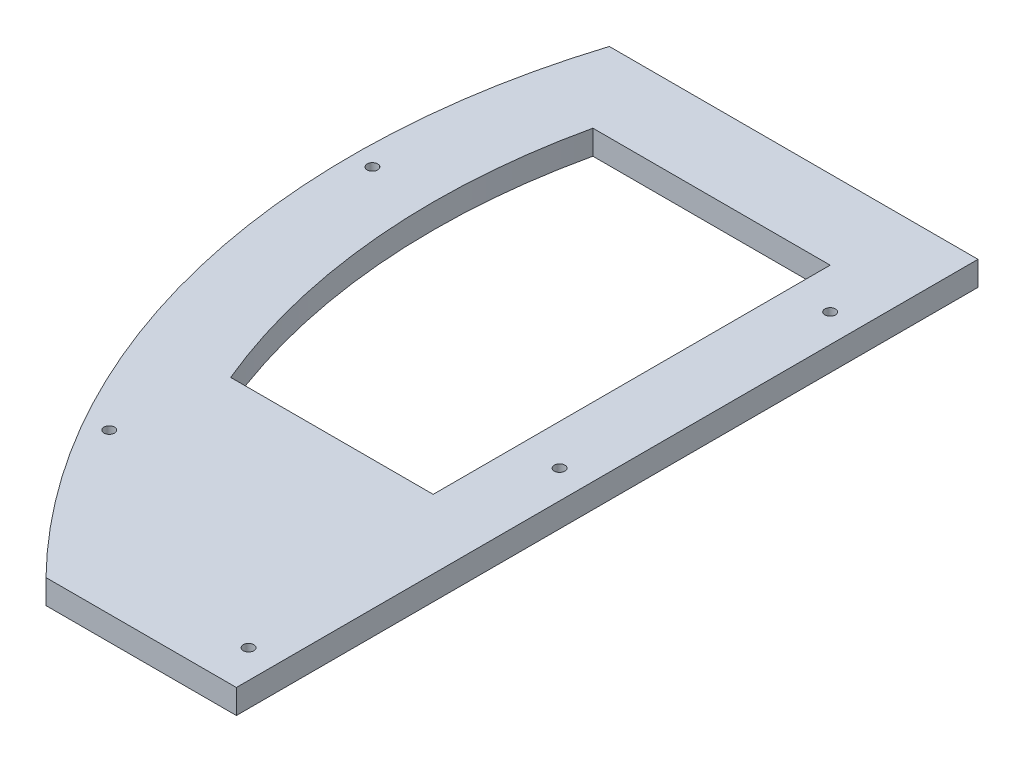
ISO-10303-21;
HEADER;
FILE_DESCRIPTION(('STEP AP214'),'2;1');
FILE_NAME('part.step','',(''),(''),'','','');
FILE_SCHEMA(('AUTOMOTIVE_DESIGN { 1 0 10303 214 1 1 1 1 }'));
ENDSEC;
DATA;
#1=APPLICATION_CONTEXT('core data for automotive mechanical design processes');
#2=APPLICATION_PROTOCOL_DEFINITION('international standard','automotive_design',2000,#1);
#3=PRODUCT_CONTEXT('',#1,'mechanical');
#4=PRODUCT('Part','Part','',(#3));
#5=PRODUCT_RELATED_PRODUCT_CATEGORY('part','',(#4));
#6=PRODUCT_DEFINITION_FORMATION('','',#4);
#7=PRODUCT_DEFINITION_CONTEXT('part definition',#1,'design');
#8=PRODUCT_DEFINITION('design','',#6,#7);
#9=PRODUCT_DEFINITION_SHAPE('','',#8);
#10=(LENGTH_UNIT() NAMED_UNIT(*) SI_UNIT(.MILLI.,.METRE.));
#11=(NAMED_UNIT(*) PLANE_ANGLE_UNIT() SI_UNIT($,.RADIAN.));
#12=(NAMED_UNIT(*) SI_UNIT($,.STERADIAN.) SOLID_ANGLE_UNIT());
#13=UNCERTAINTY_MEASURE_WITH_UNIT(LENGTH_MEASURE(1.E-05),#10,'distance_accuracy_value','');
#14=(GEOMETRIC_REPRESENTATION_CONTEXT(3) GLOBAL_UNCERTAINTY_ASSIGNED_CONTEXT((#13)) GLOBAL_UNIT_ASSIGNED_CONTEXT((#10,
#11,#12)) REPRESENTATION_CONTEXT('',''));
#15=CARTESIAN_POINT('',(0.,0.,0.));
#16=DIRECTION('',(0.,0.,1.));
#17=DIRECTION('',(1.,0.,0.));
#18=AXIS2_PLACEMENT_3D('',#15,#16,#17);
#19=CARTESIAN_POINT('',(0.,6.,0.));
#20=DIRECTION('',(0.,1.,0.));
#21=DIRECTION('',(0.,0.,1.));
#22=AXIS2_PLACEMENT_3D('',#19,#20,#21);
#23=PLANE('',#22);
#24=CARTESIAN_POINT('',(0.,6.,0.));
#25=DIRECTION('',(0.,-1.,0.));
#26=DIRECTION('',(0.,0.,1.));
#27=AXIS2_PLACEMENT_3D('',#24,#25,#26);
#28=CIRCLE('',#27,162.5);
#29=CARTESIAN_POINT('',(-150.,6.,62.5));
#30=VERTEX_POINT('',#29);
#31=CARTESIAN_POINT('',(-158.57490343683,6.,-35.5));
#32=VERTEX_POINT('',#31);
#33=EDGE_CURVE('E165',#30,#32,#28,.T.);
#34=ORIENTED_EDGE('',*,*,#33,.T.);
#35=DIRECTION('',(-1.,0.,0.));
#36=VECTOR('',#35,1.);
#37=CARTESIAN_POINT('',(-158.57490343683,6.,-35.5));
#38=LINE('',#37,#36);
#39=CARTESIAN_POINT('',(-100.,6.,-35.5));
#40=VERTEX_POINT('',#39);
#41=EDGE_CURVE('E134',#40,#32,#38,.T.);
#42=ORIENTED_EDGE('',*,*,#41,.F.);
#43=DIRECTION('',(0.,0.,-1.));
#44=VECTOR('',#43,1.);
#45=CARTESIAN_POINT('',(-100.,6.,-35.5));
#46=LINE('',#45,#44);
#47=CARTESIAN_POINT('',(-100.,6.,62.5));
#48=VERTEX_POINT('',#47);
#49=EDGE_CURVE('E142',#48,#40,#46,.T.);
#50=ORIENTED_EDGE('',*,*,#49,.F.);
#51=DIRECTION('',(1.,0.,0.));
#52=VECTOR('',#51,1.);
#53=CARTESIAN_POINT('',(-150.,6.,62.5));
#54=LINE('',#53,#52);
#55=EDGE_CURVE('E129',#30,#48,#54,.T.);
#56=ORIENTED_EDGE('',*,*,#55,.F.);
#57=EDGE_LOOP('',(#34,#42,#50,#56));
#58=FACE_BOUND('',#57,.T.);
#59=CARTESIAN_POINT('',(-153.719509171738,6.,88.7500000000001));
#60=DIRECTION('',(0.,1.,0.));
#61=DIRECTION('',(0.,0.,1.));
#62=AXIS2_PLACEMENT_3D('',#59,#60,#61);
#63=CIRCLE('',#62,1.30000000000001);
#64=CARTESIAN_POINT('',(-153.719509171738,6.,90.0500000000001));
#65=VERTEX_POINT('',#64);
#66=EDGE_CURVE('E173',#65,#65,#63,.T.);
#67=ORIENTED_EDGE('',*,*,#66,.F.);
#68=EDGE_LOOP('',(#67));
#69=FACE_BOUND('',#68,.T.);
#70=CARTESIAN_POINT('',(-177.5,6.,0.));
#71=DIRECTION('',(0.,1.,0.));
#72=DIRECTION('',(0.,0.,1.));
#73=AXIS2_PLACEMENT_3D('',#70,#71,#72);
#74=CIRCLE('',#73,1.30000000000001);
#75=CARTESIAN_POINT('',(-177.5,6.,1.30000000000004));
#76=VERTEX_POINT('',#75);
#77=EDGE_CURVE('E181',#76,#76,#74,.T.);
#78=ORIENTED_EDGE('',*,*,#77,.F.);
#79=EDGE_LOOP('',(#78));
#80=FACE_BOUND('',#79,.T.);
#81=CARTESIAN_POINT('',(-90.,6.,118.086884574495));
#82=DIRECTION('',(0.,1.,0.));
#83=DIRECTION('',(0.,0.,1.));
#84=AXIS2_PLACEMENT_3D('',#81,#82,#83);
#85=CIRCLE('',#84,1.29999999999999);
#86=CARTESIAN_POINT('',(-90.,6.,119.386884574495));
#87=VERTEX_POINT('',#86);
#88=EDGE_CURVE('E187',#87,#87,#85,.T.);
#89=ORIENTED_EDGE('',*,*,#88,.F.);
#90=EDGE_LOOP('',(#89));
#91=FACE_BOUND('',#90,.T.);
#92=CARTESIAN_POINT('',(-90.,6.,-25.5));
#93=DIRECTION('',(0.,1.,0.));
#94=DIRECTION('',(0.,0.,1.));
#95=AXIS2_PLACEMENT_3D('',#92,#93,#94);
#96=CIRCLE('',#95,1.29999999999999);
#97=CARTESIAN_POINT('',(-90.,6.,-24.2));
#98=VERTEX_POINT('',#97);
#99=EDGE_CURVE('E193',#98,#98,#96,.T.);
#100=ORIENTED_EDGE('',*,*,#99,.F.);
#101=EDGE_LOOP('',(#100));
#102=FACE_BOUND('',#101,.T.);
#103=CARTESIAN_POINT('',(-90.,6.,41.2934422872475));
#104=DIRECTION('',(0.,1.,0.));
#105=DIRECTION('',(0.,0.,1.));
#106=AXIS2_PLACEMENT_3D('',#103,#104,#105);
#107=CIRCLE('',#106,1.29999999999999);
#108=CARTESIAN_POINT('',(-90.,6.,42.5934422872475));
#109=VERTEX_POINT('',#108);
#110=EDGE_CURVE('E199',#109,#109,#107,.T.);
#111=ORIENTED_EDGE('',*,*,#110,.F.);
#112=EDGE_LOOP('',(#111));
#113=FACE_BOUND('',#112,.T.);
#114=DIRECTION('',(1.,0.,0.));
#115=VECTOR('',#114,1.);
#116=CARTESIAN_POINT('',(-100.,6.,128.086884574495));
#117=LINE('',#116,#115);
#118=CARTESIAN_POINT('',(-130.,6.,128.086884574495));
#119=VERTEX_POINT('',#118);
#120=CARTESIAN_POINT('',(-83.,6.,128.086884574495));
#121=VERTEX_POINT('',#120);
#122=EDGE_CURVE('E37',#119,#121,#117,.T.);
#123=ORIENTED_EDGE('',*,*,#122,.T.);
#124=DIRECTION('',(0.,0.,-1.));
#125=VECTOR('',#124,1.);
#126=CARTESIAN_POINT('',(-83.,6.,-55.));
#127=LINE('',#126,#125);
#128=CARTESIAN_POINT('',(-83.,6.,-55.));
#129=VERTEX_POINT('',#128);
#130=EDGE_CURVE('E99',#121,#129,#127,.T.);
#131=ORIENTED_EDGE('',*,*,#130,.T.);
#132=DIRECTION('',(1.,0.,0.));
#133=VECTOR('',#132,1.);
#134=CARTESIAN_POINT('',(-105.,6.,-55.));
#135=LINE('',#134,#133);
#136=CARTESIAN_POINT('',(-174.015085552949,6.,-55.));
#137=VERTEX_POINT('',#136);
#138=EDGE_CURVE('E118',#137,#129,#135,.T.);
#139=ORIENTED_EDGE('',*,*,#138,.F.);
#140=CARTESIAN_POINT('',(0.,6.,0.));
#141=DIRECTION('',(0.,1.,0.));
#142=DIRECTION('',(0.,0.,1.));
#143=AXIS2_PLACEMENT_3D('',#140,#141,#142);
#144=CIRCLE('',#143,182.5);
#145=EDGE_CURVE('E127',#137,#119,#144,.T.);
#146=ORIENTED_EDGE('',*,*,#145,.T.);
#147=EDGE_LOOP('',(#123,#131,#139,#146));
#148=FACE_BOUND('',#147,.T.);
#149=ADVANCED_FACE('F33',(#58,#69,#80,#91,#102,#113,#148),#23,.T.);
#150=CARTESIAN_POINT('',(0.,0.,0.));
#151=DIRECTION('',(0.,1.,0.));
#152=DIRECTION('',(0.,0.,1.));
#153=AXIS2_PLACEMENT_3D('',#150,#151,#152);
#154=PLANE('',#153);
#155=DIRECTION('',(-1.,0.,0.));
#156=VECTOR('',#155,1.);
#157=CARTESIAN_POINT('',(-158.57490343683,0.,-35.5));
#158=LINE('',#157,#156);
#159=CARTESIAN_POINT('',(-100.,0.,-35.5));
#160=VERTEX_POINT('',#159);
#161=CARTESIAN_POINT('',(-158.57490343683,0.,-35.5));
#162=VERTEX_POINT('',#161);
#163=EDGE_CURVE('E136',#160,#162,#158,.T.);
#164=ORIENTED_EDGE('',*,*,#163,.T.);
#165=CARTESIAN_POINT('',(0.,0.,0.));
#166=DIRECTION('',(0.,-1.,0.));
#167=DIRECTION('',(0.,0.,1.));
#168=AXIS2_PLACEMENT_3D('',#165,#166,#167);
#169=CIRCLE('',#168,162.5);
#170=CARTESIAN_POINT('',(-150.,0.,62.5));
#171=VERTEX_POINT('',#170);
#172=EDGE_CURVE('E123',#171,#162,#169,.T.);
#173=ORIENTED_EDGE('',*,*,#172,.F.);
#174=DIRECTION('',(1.,0.,0.));
#175=VECTOR('',#174,1.);
#176=CARTESIAN_POINT('',(-150.,0.,62.5));
#177=LINE('',#176,#175);
#178=CARTESIAN_POINT('',(-100.,0.,62.5));
#179=VERTEX_POINT('',#178);
#180=EDGE_CURVE('E131',#171,#179,#177,.T.);
#181=ORIENTED_EDGE('',*,*,#180,.T.);
#182=DIRECTION('',(0.,0.,-1.));
#183=VECTOR('',#182,1.);
#184=CARTESIAN_POINT('',(-100.,0.,-35.5));
#185=LINE('',#184,#183);
#186=EDGE_CURVE('E56',#179,#160,#185,.T.);
#187=ORIENTED_EDGE('',*,*,#186,.T.);
#188=EDGE_LOOP('',(#164,#173,#181,#187));
#189=FACE_BOUND('',#188,.T.);
#190=CARTESIAN_POINT('',(-153.719509171738,0.,88.7500000000001));
#191=DIRECTION('',(0.,1.,0.));
#192=DIRECTION('',(0.,0.,1.));
#193=AXIS2_PLACEMENT_3D('',#190,#191,#192);
#194=CIRCLE('',#193,1.30000000000001);
#195=CARTESIAN_POINT('',(-153.719509171738,0.,90.0500000000001));
#196=VERTEX_POINT('',#195);
#197=EDGE_CURVE('E175',#196,#196,#194,.T.);
#198=ORIENTED_EDGE('',*,*,#197,.T.);
#199=EDGE_LOOP('',(#198));
#200=FACE_BOUND('',#199,.T.);
#201=CARTESIAN_POINT('',(-177.5,0.,0.));
#202=DIRECTION('',(0.,1.,0.));
#203=DIRECTION('',(0.,0.,1.));
#204=AXIS2_PLACEMENT_3D('',#201,#202,#203);
#205=CIRCLE('',#204,1.30000000000001);
#206=CARTESIAN_POINT('',(-177.5,0.,1.30000000000004));
#207=VERTEX_POINT('',#206);
#208=EDGE_CURVE('E179',#207,#207,#205,.T.);
#209=ORIENTED_EDGE('',*,*,#208,.T.);
#210=EDGE_LOOP('',(#209));
#211=FACE_BOUND('',#210,.T.);
#212=CARTESIAN_POINT('',(-90.,0.,118.086884574495));
#213=DIRECTION('',(0.,1.,0.));
#214=DIRECTION('',(0.,0.,1.));
#215=AXIS2_PLACEMENT_3D('',#212,#213,#214);
#216=CIRCLE('',#215,1.29999999999999);
#217=CARTESIAN_POINT('',(-90.,0.,119.386884574495));
#218=VERTEX_POINT('',#217);
#219=EDGE_CURVE('E184',#218,#218,#216,.T.);
#220=ORIENTED_EDGE('',*,*,#219,.T.);
#221=EDGE_LOOP('',(#220));
#222=FACE_BOUND('',#221,.T.);
#223=CARTESIAN_POINT('',(-90.,0.,-25.5));
#224=DIRECTION('',(0.,1.,0.));
#225=DIRECTION('',(0.,0.,1.));
#226=AXIS2_PLACEMENT_3D('',#223,#224,#225);
#227=CIRCLE('',#226,1.29999999999999);
#228=CARTESIAN_POINT('',(-90.,0.,-24.2));
#229=VERTEX_POINT('',#228);
#230=EDGE_CURVE('E190',#229,#229,#227,.T.);
#231=ORIENTED_EDGE('',*,*,#230,.T.);
#232=EDGE_LOOP('',(#231));
#233=FACE_BOUND('',#232,.T.);
#234=CARTESIAN_POINT('',(-90.,0.,41.2934422872475));
#235=DIRECTION('',(0.,1.,0.));
#236=DIRECTION('',(0.,0.,1.));
#237=AXIS2_PLACEMENT_3D('',#234,#235,#236);
#238=CIRCLE('',#237,1.29999999999999);
#239=CARTESIAN_POINT('',(-90.,0.,42.5934422872475));
#240=VERTEX_POINT('',#239);
#241=EDGE_CURVE('E196',#240,#240,#238,.T.);
#242=ORIENTED_EDGE('',*,*,#241,.T.);
#243=EDGE_LOOP('',(#242));
#244=FACE_BOUND('',#243,.T.);
#245=DIRECTION('',(0.,0.,-1.));
#246=VECTOR('',#245,1.);
#247=CARTESIAN_POINT('',(-83.,0.,-55.));
#248=LINE('',#247,#246);
#249=CARTESIAN_POINT('',(-83.,0.,128.086884574495));
#250=VERTEX_POINT('',#249);
#251=CARTESIAN_POINT('',(-83.,0.,-55.));
#252=VERTEX_POINT('',#251);
#253=EDGE_CURVE('E48',#250,#252,#248,.T.);
#254=ORIENTED_EDGE('',*,*,#253,.F.);
#255=DIRECTION('',(1.,0.,0.));
#256=VECTOR('',#255,1.);
#257=CARTESIAN_POINT('',(-100.,0.,128.086884574495));
#258=LINE('',#257,#256);
#259=CARTESIAN_POINT('',(-130.,0.,128.086884574495));
#260=VERTEX_POINT('',#259);
#261=EDGE_CURVE('E11',#260,#250,#258,.T.);
#262=ORIENTED_EDGE('',*,*,#261,.F.);
#263=CARTESIAN_POINT('',(0.,0.,0.));
#264=DIRECTION('',(0.,1.,0.));
#265=DIRECTION('',(0.,0.,1.));
#266=AXIS2_PLACEMENT_3D('',#263,#264,#265);
#267=CIRCLE('',#266,182.5);
#268=CARTESIAN_POINT('',(-174.015085552949,0.,-55.));
#269=VERTEX_POINT('',#268);
#270=EDGE_CURVE('E119',#269,#260,#267,.T.);
#271=ORIENTED_EDGE('',*,*,#270,.F.);
#272=DIRECTION('',(1.,0.,0.));
#273=VECTOR('',#272,1.);
#274=CARTESIAN_POINT('',(-105.,0.,-55.));
#275=LINE('',#274,#273);
#276=EDGE_CURVE('E111',#269,#252,#275,.T.);
#277=ORIENTED_EDGE('',*,*,#276,.T.);
#278=EDGE_LOOP('',(#254,#262,#271,#277));
#279=FACE_BOUND('',#278,.T.);
#280=ADVANCED_FACE('F35',(#189,#200,#211,#222,#233,#244,#279),#154,.F.);
#281=CARTESIAN_POINT('',(-100.,0.,128.086884574495));
#282=DIRECTION('',(0.,0.,1.));
#283=DIRECTION('',(1.,0.,0.));
#284=AXIS2_PLACEMENT_3D('',#281,#282,#283);
#285=PLANE('',#284);
#286=ORIENTED_EDGE('',*,*,#261,.T.);
#287=DIRECTION('',(0.,1.,0.));
#288=VECTOR('',#287,1.);
#289=CARTESIAN_POINT('',(-83.,0.,128.086884574495));
#290=LINE('',#289,#288);
#291=EDGE_CURVE('E96',#250,#121,#290,.T.);
#292=ORIENTED_EDGE('',*,*,#291,.T.);
#293=ORIENTED_EDGE('',*,*,#122,.F.);
#294=DIRECTION('',(0.,1.,0.));
#295=VECTOR('',#294,1.);
#296=CARTESIAN_POINT('',(-130.,0.,128.086884574495));
#297=LINE('',#296,#295);
#298=EDGE_CURVE('E115',#260,#119,#297,.T.);
#299=ORIENTED_EDGE('',*,*,#298,.F.);
#300=EDGE_LOOP('',(#286,#292,#293,#299));
#301=FACE_BOUND('',#300,.T.);
#302=ADVANCED_FACE('F113',(#301),#285,.T.);
#303=CARTESIAN_POINT('',(-105.,0.,-55.));
#304=DIRECTION('',(0.,0.,1.));
#305=DIRECTION('',(1.,0.,0.));
#306=AXIS2_PLACEMENT_3D('',#303,#304,#305);
#307=PLANE('',#306);
#308=DIRECTION('',(0.,1.,0.));
#309=VECTOR('',#308,1.);
#310=CARTESIAN_POINT('',(-83.,0.,-55.));
#311=LINE('',#310,#309);
#312=EDGE_CURVE('E103',#252,#129,#311,.T.);
#313=ORIENTED_EDGE('',*,*,#312,.F.);
#314=ORIENTED_EDGE('',*,*,#276,.F.);
#315=DIRECTION('',(0.,1.,0.));
#316=VECTOR('',#315,1.);
#317=CARTESIAN_POINT('',(-174.015085552949,0.,-55.));
#318=LINE('',#317,#316);
#319=EDGE_CURVE('E104',#269,#137,#318,.T.);
#320=ORIENTED_EDGE('',*,*,#319,.T.);
#321=ORIENTED_EDGE('',*,*,#138,.T.);
#322=EDGE_LOOP('',(#313,#314,#320,#321));
#323=FACE_BOUND('',#322,.T.);
#324=ADVANCED_FACE('F209',(#323),#307,.F.);
#325=CARTESIAN_POINT('',(0.,0.,0.));
#326=DIRECTION('',(0.,1.,0.));
#327=DIRECTION('',(0.,0.,1.));
#328=AXIS2_PLACEMENT_3D('',#325,#326,#327);
#329=CYLINDRICAL_SURFACE('',#328,182.5);
#330=ORIENTED_EDGE('',*,*,#145,.F.);
#331=ORIENTED_EDGE('',*,*,#319,.F.);
#332=ORIENTED_EDGE('',*,*,#270,.T.);
#333=ORIENTED_EDGE('',*,*,#298,.T.);
#334=EDGE_LOOP('',(#330,#331,#332,#333));
#335=FACE_BOUND('',#334,.T.);
#336=ADVANCED_FACE('F211',(#335),#329,.T.);
#337=CARTESIAN_POINT('',(-158.57490343683,0.,-35.5));
#338=DIRECTION('',(0.,0.,-1.));
#339=DIRECTION('',(-1.,0.,0.));
#340=AXIS2_PLACEMENT_3D('',#337,#338,#339);
#341=PLANE('',#340);
#342=ORIENTED_EDGE('',*,*,#41,.T.);
#343=DIRECTION('',(0.,1.,0.));
#344=VECTOR('',#343,1.);
#345=CARTESIAN_POINT('',(-158.57490343683,0.,-35.5));
#346=LINE('',#345,#344);
#347=EDGE_CURVE('E147',#162,#32,#346,.T.);
#348=ORIENTED_EDGE('',*,*,#347,.F.);
#349=ORIENTED_EDGE('',*,*,#163,.F.);
#350=DIRECTION('',(0.,1.,0.));
#351=VECTOR('',#350,1.);
#352=CARTESIAN_POINT('',(-100.,0.,-35.5));
#353=LINE('',#352,#351);
#354=EDGE_CURVE('E149',#160,#40,#353,.T.);
#355=ORIENTED_EDGE('',*,*,#354,.T.);
#356=EDGE_LOOP('',(#342,#348,#349,#355));
#357=FACE_BOUND('',#356,.T.);
#358=ADVANCED_FACE('F213',(#357),#341,.F.);
#359=CARTESIAN_POINT('',(-100.,0.,-35.5));
#360=DIRECTION('',(1.,0.,0.));
#361=DIRECTION('',(0.,0.,-1.));
#362=AXIS2_PLACEMENT_3D('',#359,#360,#361);
#363=PLANE('',#362);
#364=ORIENTED_EDGE('',*,*,#49,.T.);
#365=ORIENTED_EDGE('',*,*,#354,.F.);
#366=ORIENTED_EDGE('',*,*,#186,.F.);
#367=DIRECTION('',(0.,1.,0.));
#368=VECTOR('',#367,1.);
#369=CARTESIAN_POINT('',(-100.,0.,62.5));
#370=LINE('',#369,#368);
#371=EDGE_CURVE('E151',#179,#48,#370,.T.);
#372=ORIENTED_EDGE('',*,*,#371,.T.);
#373=EDGE_LOOP('',(#364,#365,#366,#372));
#374=FACE_BOUND('',#373,.T.);
#375=ADVANCED_FACE('F166',(#374),#363,.F.);
#376=CARTESIAN_POINT('',(-150.,0.,62.5));
#377=DIRECTION('',(0.,0.,1.));
#378=DIRECTION('',(1.,0.,0.));
#379=AXIS2_PLACEMENT_3D('',#376,#377,#378);
#380=PLANE('',#379);
#381=ORIENTED_EDGE('',*,*,#55,.T.);
#382=ORIENTED_EDGE('',*,*,#371,.F.);
#383=ORIENTED_EDGE('',*,*,#180,.F.);
#384=DIRECTION('',(0.,1.,0.));
#385=VECTOR('',#384,1.);
#386=CARTESIAN_POINT('',(-150.,0.,62.5));
#387=LINE('',#386,#385);
#388=EDGE_CURVE('E139',#171,#30,#387,.T.);
#389=ORIENTED_EDGE('',*,*,#388,.T.);
#390=EDGE_LOOP('',(#381,#382,#383,#389));
#391=FACE_BOUND('',#390,.T.);
#392=ADVANCED_FACE('F157',(#391),#380,.F.);
#393=CARTESIAN_POINT('',(0.,0.,0.));
#394=DIRECTION('',(0.,1.,0.));
#395=DIRECTION('',(0.,0.,1.));
#396=AXIS2_PLACEMENT_3D('',#393,#394,#395);
#397=CYLINDRICAL_SURFACE('',#396,162.5);
#398=ORIENTED_EDGE('',*,*,#347,.T.);
#399=ORIENTED_EDGE('',*,*,#33,.F.);
#400=ORIENTED_EDGE('',*,*,#388,.F.);
#401=ORIENTED_EDGE('',*,*,#172,.T.);
#402=EDGE_LOOP('',(#398,#399,#400,#401));
#403=FACE_BOUND('',#402,.T.);
#404=ADVANCED_FACE('F236',(#403),#397,.F.);
#405=CARTESIAN_POINT('',(-153.719509171738,0.,88.7500000000001));
#406=DIRECTION('',(0.,1.,0.));
#407=DIRECTION('',(0.,0.,1.));
#408=AXIS2_PLACEMENT_3D('',#405,#406,#407);
#409=CYLINDRICAL_SURFACE('',#408,1.30000000000001);
#410=ORIENTED_EDGE('',*,*,#197,.F.);
#411=EDGE_LOOP('',(#410));
#412=FACE_BOUND('',#411,.T.);
#413=ORIENTED_EDGE('',*,*,#66,.T.);
#414=EDGE_LOOP('',(#413));
#415=FACE_BOUND('',#414,.T.);
#416=ADVANCED_FACE('F239',(#412,#415),#409,.F.);
#417=CARTESIAN_POINT('',(-177.5,0.,0.));
#418=DIRECTION('',(0.,1.,0.));
#419=DIRECTION('',(0.,0.,1.));
#420=AXIS2_PLACEMENT_3D('',#417,#418,#419);
#421=CYLINDRICAL_SURFACE('',#420,1.30000000000001);
#422=ORIENTED_EDGE('',*,*,#208,.F.);
#423=EDGE_LOOP('',(#422));
#424=FACE_BOUND('',#423,.T.);
#425=ORIENTED_EDGE('',*,*,#77,.T.);
#426=EDGE_LOOP('',(#425));
#427=FACE_BOUND('',#426,.T.);
#428=ADVANCED_FACE('F243',(#424,#427),#421,.F.);
#429=CARTESIAN_POINT('',(-90.,0.,118.086884574495));
#430=DIRECTION('',(0.,1.,0.));
#431=DIRECTION('',(0.,0.,1.));
#432=AXIS2_PLACEMENT_3D('',#429,#430,#431);
#433=CYLINDRICAL_SURFACE('',#432,1.29999999999999);
#434=ORIENTED_EDGE('',*,*,#219,.F.);
#435=EDGE_LOOP('',(#434));
#436=FACE_BOUND('',#435,.T.);
#437=ORIENTED_EDGE('',*,*,#88,.T.);
#438=EDGE_LOOP('',(#437));
#439=FACE_BOUND('',#438,.T.);
#440=ADVANCED_FACE('F248',(#436,#439),#433,.F.);
#441=CARTESIAN_POINT('',(-90.,0.,-25.5));
#442=DIRECTION('',(0.,1.,0.));
#443=DIRECTION('',(0.,0.,1.));
#444=AXIS2_PLACEMENT_3D('',#441,#442,#443);
#445=CYLINDRICAL_SURFACE('',#444,1.29999999999999);
#446=ORIENTED_EDGE('',*,*,#230,.F.);
#447=EDGE_LOOP('',(#446));
#448=FACE_BOUND('',#447,.T.);
#449=ORIENTED_EDGE('',*,*,#99,.T.);
#450=EDGE_LOOP('',(#449));
#451=FACE_BOUND('',#450,.T.);
#452=ADVANCED_FACE('F255',(#448,#451),#445,.F.);
#453=CARTESIAN_POINT('',(-90.,0.,41.2934422872475));
#454=DIRECTION('',(0.,1.,0.));
#455=DIRECTION('',(0.,0.,1.));
#456=AXIS2_PLACEMENT_3D('',#453,#454,#455);
#457=CYLINDRICAL_SURFACE('',#456,1.29999999999999);
#458=ORIENTED_EDGE('',*,*,#241,.F.);
#459=EDGE_LOOP('',(#458));
#460=FACE_BOUND('',#459,.T.);
#461=ORIENTED_EDGE('',*,*,#110,.T.);
#462=EDGE_LOOP('',(#461));
#463=FACE_BOUND('',#462,.T.);
#464=ADVANCED_FACE('F259',(#460,#463),#457,.F.);
#465=CARTESIAN_POINT('',(-83.,0.,-55.));
#466=DIRECTION('',(1.,0.,0.));
#467=DIRECTION('',(0.,0.,-1.));
#468=AXIS2_PLACEMENT_3D('',#465,#466,#467);
#469=PLANE('',#468);
#470=ORIENTED_EDGE('',*,*,#130,.F.);
#471=ORIENTED_EDGE('',*,*,#291,.F.);
#472=ORIENTED_EDGE('',*,*,#253,.T.);
#473=ORIENTED_EDGE('',*,*,#312,.T.);
#474=EDGE_LOOP('',(#470,#471,#472,#473));
#475=FACE_BOUND('',#474,.T.);
#476=ADVANCED_FACE('F97',(#475),#469,.T.);
#477=CLOSED_SHELL('',(#149,#280,#302,#324,#336,#358,#375,#392,#404,#416,#428,#440,#452,#464,#476));
#478=MANIFOLD_SOLID_BREP('B2',#477);
#479=ADVANCED_BREP_SHAPE_REPRESENTATION('',(#18,#478),#14);
#480=SHAPE_DEFINITION_REPRESENTATION(#9,#479);
ENDSEC;
END-ISO-10303-21;
